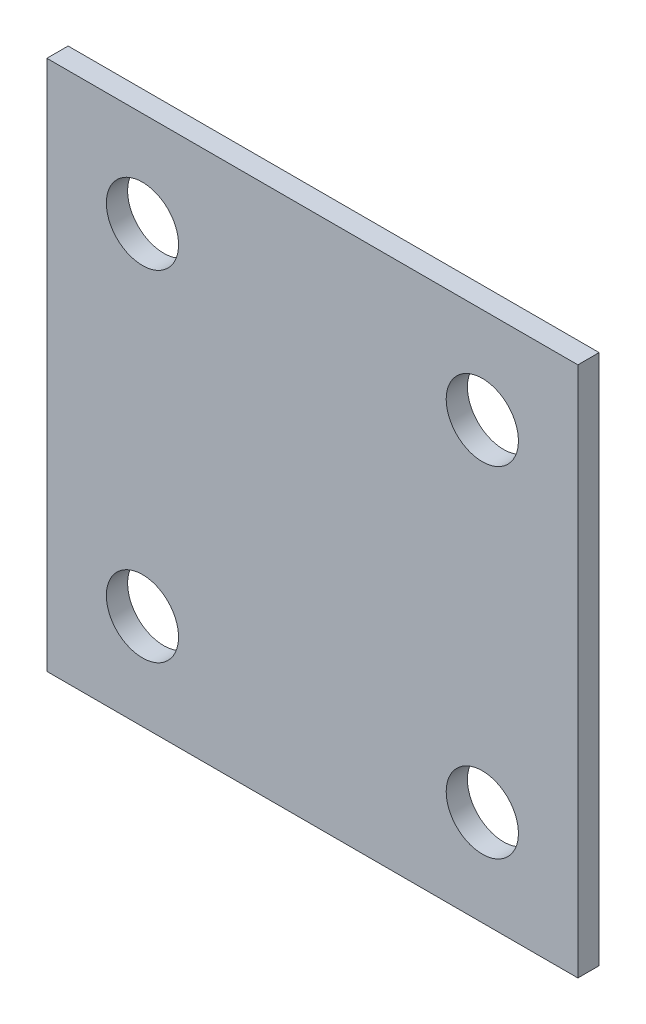
ISO-10303-21;
HEADER;
FILE_DESCRIPTION(('STEP AP214'),'2;1');
FILE_NAME('part.step','',(''),(''),'','','');
FILE_SCHEMA(('AUTOMOTIVE_DESIGN { 1 0 10303 214 1 1 1 1 }'));
ENDSEC;
DATA;
#1=APPLICATION_CONTEXT('core data for automotive mechanical design processes');
#2=APPLICATION_PROTOCOL_DEFINITION('international standard','automotive_design',2000,#1);
#3=PRODUCT_CONTEXT('',#1,'mechanical');
#4=PRODUCT('Part','Part','',(#3));
#5=PRODUCT_RELATED_PRODUCT_CATEGORY('part','',(#4));
#6=PRODUCT_DEFINITION_FORMATION('','',#4);
#7=PRODUCT_DEFINITION_CONTEXT('part definition',#1,'design');
#8=PRODUCT_DEFINITION('design','',#6,#7);
#9=PRODUCT_DEFINITION_SHAPE('','',#8);
#10=(LENGTH_UNIT() NAMED_UNIT(*) SI_UNIT(.MILLI.,.METRE.));
#11=(NAMED_UNIT(*) PLANE_ANGLE_UNIT() SI_UNIT($,.RADIAN.));
#12=(NAMED_UNIT(*) SI_UNIT($,.STERADIAN.) SOLID_ANGLE_UNIT());
#13=UNCERTAINTY_MEASURE_WITH_UNIT(LENGTH_MEASURE(1.E-05),#10,'distance_accuracy_value','');
#14=(GEOMETRIC_REPRESENTATION_CONTEXT(3) GLOBAL_UNCERTAINTY_ASSIGNED_CONTEXT((#13)) GLOBAL_UNIT_ASSIGNED_CONTEXT((#10,
#11,#12)) REPRESENTATION_CONTEXT('',''));
#15=CARTESIAN_POINT('',(0.,0.,0.));
#16=DIRECTION('',(0.,0.,1.));
#17=DIRECTION('',(1.,0.,0.));
#18=AXIS2_PLACEMENT_3D('',#15,#16,#17);
#19=CARTESIAN_POINT('',(-12.4999999999998,-12.5000000000002,1.));
#20=DIRECTION('',(1.,0.,0.));
#21=DIRECTION('',(0.,0.,-0.999999999999998));
#22=AXIS2_PLACEMENT_3D('',#19,#20,#21);
#23=PLANE('',#22);
#24=DIRECTION('',(0.,-1.,0.));
#25=VECTOR('',#24,1.);
#26=CARTESIAN_POINT('',(-12.4999999999998,-12.5000000000002,0.));
#27=LINE('',#26,#25);
#28=CARTESIAN_POINT('',(-12.5,12.4999999999998,0.));
#29=VERTEX_POINT('',#28);
#30=CARTESIAN_POINT('',(-12.4999999999998,-12.5000000000002,0.));
#31=VERTEX_POINT('',#30);
#32=EDGE_CURVE('E95',#29,#31,#27,.T.);
#33=ORIENTED_EDGE('',*,*,#32,.T.);
#34=DIRECTION('',(0.,0.,-0.999999999999998));
#35=VECTOR('',#34,1.);
#36=CARTESIAN_POINT('',(-12.4999999999998,-12.5000000000002,1.));
#37=LINE('',#36,#35);
#38=CARTESIAN_POINT('',(-12.4999999999998,-12.5000000000002,1.));
#39=VERTEX_POINT('',#38);
#40=EDGE_CURVE('E11',#39,#31,#37,.T.);
#41=ORIENTED_EDGE('',*,*,#40,.F.);
#42=DIRECTION('',(0.,-1.,0.));
#43=VECTOR('',#42,1.);
#44=CARTESIAN_POINT('',(-12.4999999999998,-12.5000000000002,1.));
#45=LINE('',#44,#43);
#46=CARTESIAN_POINT('',(-12.5,12.4999999999998,0.999999999999997));
#47=VERTEX_POINT('',#46);
#48=EDGE_CURVE('E83',#47,#39,#45,.T.);
#49=ORIENTED_EDGE('',*,*,#48,.F.);
#50=DIRECTION('',(0.,0.,-0.999999999999998));
#51=VECTOR('',#50,1.);
#52=CARTESIAN_POINT('',(-12.5,12.4999999999998,0.999999999999997));
#53=LINE('',#52,#51);
#54=EDGE_CURVE('E91',#47,#29,#53,.T.);
#55=ORIENTED_EDGE('',*,*,#54,.T.);
#56=EDGE_LOOP('',(#33,#41,#49,#55));
#57=FACE_BOUND('',#56,.T.);
#58=ADVANCED_FACE('F32',(#57),#23,.F.);
#59=CARTESIAN_POINT('',(12.5000000000002,-12.5,1.));
#60=DIRECTION('',(0.,1.,0.));
#61=DIRECTION('',(-1.,0.,0.));
#62=AXIS2_PLACEMENT_3D('',#59,#60,#61);
#63=PLANE('',#62);
#64=DIRECTION('',(1.,0.,0.));
#65=VECTOR('',#64,1.);
#66=CARTESIAN_POINT('',(12.5000000000002,-12.5,0.));
#67=LINE('',#66,#65);
#68=CARTESIAN_POINT('',(12.5000000000002,-12.5,0.));
#69=VERTEX_POINT('',#68);
#70=EDGE_CURVE('E87',#31,#69,#67,.T.);
#71=ORIENTED_EDGE('',*,*,#70,.T.);
#72=DIRECTION('',(0.,0.,-0.999999999999998));
#73=VECTOR('',#72,1.);
#74=CARTESIAN_POINT('',(12.5000000000002,-12.5,1.));
#75=LINE('',#74,#73);
#76=CARTESIAN_POINT('',(12.5000000000002,-12.5,1.));
#77=VERTEX_POINT('',#76);
#78=EDGE_CURVE('E40',#77,#69,#75,.T.);
#79=ORIENTED_EDGE('',*,*,#78,.F.);
#80=DIRECTION('',(1.,0.,0.));
#81=VECTOR('',#80,1.);
#82=CARTESIAN_POINT('',(12.5000000000002,-12.5,1.));
#83=LINE('',#82,#81);
#84=EDGE_CURVE('E78',#39,#77,#83,.T.);
#85=ORIENTED_EDGE('',*,*,#84,.F.);
#86=ORIENTED_EDGE('',*,*,#40,.T.);
#87=EDGE_LOOP('',(#71,#79,#85,#86));
#88=FACE_BOUND('',#87,.T.);
#89=ADVANCED_FACE('F86',(#88),#63,.F.);
#90=CARTESIAN_POINT('',(12.5000000000002,-12.5,1.));
#91=DIRECTION('',(-1.,0.,0.));
#92=DIRECTION('',(0.,0.,0.999999999999998));
#93=AXIS2_PLACEMENT_3D('',#90,#91,#92);
#94=PLANE('',#93);
#95=DIRECTION('',(0.,1.,0.));
#96=VECTOR('',#95,1.);
#97=CARTESIAN_POINT('',(12.5000000000002,-12.5,0.));
#98=LINE('',#97,#96);
#99=CARTESIAN_POINT('',(12.5000000000001,12.5,0.));
#100=VERTEX_POINT('',#99);
#101=EDGE_CURVE('E65',#69,#100,#98,.T.);
#102=ORIENTED_EDGE('',*,*,#101,.T.);
#103=DIRECTION('',(0.,0.,-0.999999999999998));
#104=VECTOR('',#103,1.);
#105=CARTESIAN_POINT('',(12.5000000000001,12.5,0.999999999999997));
#106=LINE('',#105,#104);
#107=CARTESIAN_POINT('',(12.5000000000001,12.5,0.999999999999997));
#108=VERTEX_POINT('',#107);
#109=EDGE_CURVE('E88',#108,#100,#106,.T.);
#110=ORIENTED_EDGE('',*,*,#109,.F.);
#111=DIRECTION('',(0.,1.,0.));
#112=VECTOR('',#111,1.);
#113=CARTESIAN_POINT('',(12.5000000000002,-12.5,1.));
#114=LINE('',#113,#112);
#115=EDGE_CURVE('E81',#77,#108,#114,.T.);
#116=ORIENTED_EDGE('',*,*,#115,.F.);
#117=ORIENTED_EDGE('',*,*,#78,.T.);
#118=EDGE_LOOP('',(#102,#110,#116,#117));
#119=FACE_BOUND('',#118,.T.);
#120=ADVANCED_FACE('F89',(#119),#94,.F.);
#121=CARTESIAN_POINT('',(12.5000000000001,12.5,0.999999999999997));
#122=DIRECTION('',(0.,-1.,0.));
#123=DIRECTION('',(1.,0.,0.));
#124=AXIS2_PLACEMENT_3D('',#121,#122,#123);
#125=PLANE('',#124);
#126=DIRECTION('',(-1.,0.,0.));
#127=VECTOR('',#126,1.);
#128=CARTESIAN_POINT('',(12.5000000000001,12.5,0.));
#129=LINE('',#128,#127);
#130=EDGE_CURVE('E71',#100,#29,#129,.T.);
#131=ORIENTED_EDGE('',*,*,#130,.T.);
#132=ORIENTED_EDGE('',*,*,#54,.F.);
#133=DIRECTION('',(-1.,0.,0.));
#134=VECTOR('',#133,1.);
#135=CARTESIAN_POINT('',(12.5000000000001,12.5,0.999999999999997));
#136=LINE('',#135,#134);
#137=EDGE_CURVE('E48',#108,#47,#136,.T.);
#138=ORIENTED_EDGE('',*,*,#137,.F.);
#139=ORIENTED_EDGE('',*,*,#109,.T.);
#140=EDGE_LOOP('',(#131,#132,#138,#139));
#141=FACE_BOUND('',#140,.T.);
#142=ADVANCED_FACE('F103',(#141),#125,.F.);
#143=CARTESIAN_POINT('',(0.,0.,0.999999999999997));
#144=DIRECTION('',(0.,0.,0.999999999999998));
#145=DIRECTION('',(1.,0.,0.));
#146=AXIS2_PLACEMENT_3D('',#143,#144,#145);
#147=PLANE('',#146);
#148=CARTESIAN_POINT('',(-7.99999999999977,-8.00000000000001,1.));
#149=DIRECTION('',(0.,0.,-0.999999999999998));
#150=DIRECTION('',(-1.,0.,0.));
#151=AXIS2_PLACEMENT_3D('',#148,#149,#150);
#152=CIRCLE('',#151,1.7);
#153=CARTESIAN_POINT('',(-9.7,-8.00000000000001,1.));
#154=VERTEX_POINT('',#153);
#155=EDGE_CURVE('E126',#154,#154,#152,.T.);
#156=ORIENTED_EDGE('',*,*,#155,.T.);
#157=EDGE_LOOP('',(#156));
#158=FACE_BOUND('',#157,.T.);
#159=CARTESIAN_POINT('',(-7.99999999999979,8.00000000000001,0.999999999999997));
#160=DIRECTION('',(0.,0.,-0.999999999999998));
#161=DIRECTION('',(-1.,0.,0.));
#162=AXIS2_PLACEMENT_3D('',#159,#160,#161);
#163=CIRCLE('',#162,1.7);
#164=CARTESIAN_POINT('',(-9.70000000000001,7.99999999999995,0.999999999999997));
#165=VERTEX_POINT('',#164);
#166=EDGE_CURVE('E120',#165,#165,#163,.T.);
#167=ORIENTED_EDGE('',*,*,#166,.T.);
#168=EDGE_LOOP('',(#167));
#169=FACE_BOUND('',#168,.T.);
#170=CARTESIAN_POINT('',(8.00000000000023,7.99999999999995,0.999999999999997));
#171=DIRECTION('',(0.,0.,-0.999999999999998));
#172=DIRECTION('',(-1.,0.,0.));
#173=AXIS2_PLACEMENT_3D('',#170,#171,#172);
#174=CIRCLE('',#173,1.7);
#175=CARTESIAN_POINT('',(6.30000000000022,7.99999999999979,0.999999999999997));
#176=VERTEX_POINT('',#175);
#177=EDGE_CURVE('E114',#176,#176,#174,.T.);
#178=ORIENTED_EDGE('',*,*,#177,.T.);
#179=EDGE_LOOP('',(#178));
#180=FACE_BOUND('',#179,.T.);
#181=CARTESIAN_POINT('',(8.00000000000024,-8.00000000000001,1.));
#182=DIRECTION('',(0.,0.,-0.999999999999998));
#183=DIRECTION('',(-1.,0.,0.));
#184=AXIS2_PLACEMENT_3D('',#181,#182,#183);
#185=CIRCLE('',#184,1.7);
#186=CARTESIAN_POINT('',(6.30000000000024,-8.00000000000017,1.));
#187=VERTEX_POINT('',#186);
#188=EDGE_CURVE('E98',#187,#187,#185,.T.);
#189=ORIENTED_EDGE('',*,*,#188,.T.);
#190=EDGE_LOOP('',(#189));
#191=FACE_BOUND('',#190,.T.);
#192=ORIENTED_EDGE('',*,*,#48,.T.);
#193=ORIENTED_EDGE('',*,*,#84,.T.);
#194=ORIENTED_EDGE('',*,*,#115,.T.);
#195=ORIENTED_EDGE('',*,*,#137,.T.);
#196=EDGE_LOOP('',(#192,#193,#194,#195));
#197=FACE_BOUND('',#196,.T.);
#198=ADVANCED_FACE('F79',(#158,#169,#180,#191,#197),#147,.T.);
#199=CARTESIAN_POINT('',(0.,0.,0.));
#200=DIRECTION('',(0.,0.,0.999999999999998));
#201=DIRECTION('',(1.,0.,0.));
#202=AXIS2_PLACEMENT_3D('',#199,#200,#201);
#203=PLANE('',#202);
#204=CARTESIAN_POINT('',(-7.99999999999999,-8.00000000000001,0.));
#205=DIRECTION('',(0.,0.,-0.999999999999998));
#206=DIRECTION('',(-1.,0.,0.));
#207=AXIS2_PLACEMENT_3D('',#204,#205,#206);
#208=CIRCLE('',#207,1.7);
#209=CARTESIAN_POINT('',(-9.7,-8.00000000000001,0.));
#210=VERTEX_POINT('',#209);
#211=EDGE_CURVE('E129',#210,#210,#208,.T.);
#212=ORIENTED_EDGE('',*,*,#211,.F.);
#213=EDGE_LOOP('',(#212));
#214=FACE_BOUND('',#213,.T.);
#215=CARTESIAN_POINT('',(-8.00000000000001,7.99999999999995,0.));
#216=DIRECTION('',(0.,0.,-0.999999999999998));
#217=DIRECTION('',(-1.,0.,0.));
#218=AXIS2_PLACEMENT_3D('',#215,#216,#217);
#219=CIRCLE('',#218,1.7);
#220=CARTESIAN_POINT('',(-9.70000000000001,7.99999999999995,0.));
#221=VERTEX_POINT('',#220);
#222=EDGE_CURVE('E123',#221,#221,#219,.T.);
#223=ORIENTED_EDGE('',*,*,#222,.F.);
#224=EDGE_LOOP('',(#223));
#225=FACE_BOUND('',#224,.T.);
#226=CARTESIAN_POINT('',(8.00000000000023,7.99999999999979,0.));
#227=DIRECTION('',(0.,0.,-0.999999999999998));
#228=DIRECTION('',(-1.,0.,0.));
#229=AXIS2_PLACEMENT_3D('',#226,#227,#228);
#230=CIRCLE('',#229,1.7);
#231=CARTESIAN_POINT('',(6.30000000000022,7.99999999999979,0.));
#232=VERTEX_POINT('',#231);
#233=EDGE_CURVE('E117',#232,#232,#230,.T.);
#234=ORIENTED_EDGE('',*,*,#233,.F.);
#235=EDGE_LOOP('',(#234));
#236=FACE_BOUND('',#235,.T.);
#237=CARTESIAN_POINT('',(8.00000000000024,-8.00000000000017,0.));
#238=DIRECTION('',(0.,0.,-0.999999999999998));
#239=DIRECTION('',(-1.,0.,0.));
#240=AXIS2_PLACEMENT_3D('',#237,#238,#239);
#241=CIRCLE('',#240,1.7);
#242=CARTESIAN_POINT('',(6.30000000000024,-8.00000000000017,0.));
#243=VERTEX_POINT('',#242);
#244=EDGE_CURVE('E111',#243,#243,#241,.T.);
#245=ORIENTED_EDGE('',*,*,#244,.F.);
#246=EDGE_LOOP('',(#245));
#247=FACE_BOUND('',#246,.T.);
#248=ORIENTED_EDGE('',*,*,#32,.F.);
#249=ORIENTED_EDGE('',*,*,#130,.F.);
#250=ORIENTED_EDGE('',*,*,#101,.F.);
#251=ORIENTED_EDGE('',*,*,#70,.F.);
#252=EDGE_LOOP('',(#248,#249,#250,#251));
#253=FACE_BOUND('',#252,.T.);
#254=ADVANCED_FACE('F106',(#214,#225,#236,#247,#253),#203,.F.);
#255=CARTESIAN_POINT('',(8.00000000000024,-8.00000000000017,0.));
#256=DIRECTION('',(0.,0.,-0.999999999999998));
#257=DIRECTION('',(-1.,0.,0.));
#258=AXIS2_PLACEMENT_3D('',#255,#256,#257);
#259=CYLINDRICAL_SURFACE('',#258,1.7);
#260=CARTESIAN_POINT('',(6.30000000000024,-8.00000000000017,1.));
#261=CARTESIAN_POINT('',(6.30000000000024,-8.00000000000017,0.989583333333333));
#262=CARTESIAN_POINT('',(6.30000000000024,-8.00000000000017,0.979166666666666));
#263=CARTESIAN_POINT('',(6.30000000000024,-8.00000000000017,0.958333333333333));
#264=CARTESIAN_POINT('',(6.30000000000024,-8.00000000000017,0.947916666666666));
#265=CARTESIAN_POINT('',(6.30000000000024,-8.00000000000017,0.927083333333333));
#266=CARTESIAN_POINT('',(6.30000000000024,-8.00000000000017,0.916666666666666));
#267=CARTESIAN_POINT('',(6.30000000000024,-8.00000000000017,0.895833333333333));
#268=CARTESIAN_POINT('',(6.30000000000024,-8.00000000000017,0.885416666666667));
#269=CARTESIAN_POINT('',(6.30000000000024,-8.00000000000017,0.864583333333333));
#270=CARTESIAN_POINT('',(6.30000000000024,-8.00000000000017,0.854166666666667));
#271=CARTESIAN_POINT('',(6.30000000000024,-8.00000000000017,0.833333333333333));
#272=CARTESIAN_POINT('',(6.30000000000024,-8.00000000000017,0.822916666666667));
#273=CARTESIAN_POINT('',(6.30000000000024,-8.00000000000017,0.802083333333333));
#274=CARTESIAN_POINT('',(6.30000000000024,-8.00000000000017,0.791666666666667));
#275=CARTESIAN_POINT('',(6.30000000000024,-8.00000000000017,0.770833333333333));
#276=CARTESIAN_POINT('',(6.30000000000024,-8.00000000000017,0.760416666666667));
#277=CARTESIAN_POINT('',(6.30000000000024,-8.00000000000017,0.739583333333333));
#278=CARTESIAN_POINT('',(6.30000000000024,-8.00000000000017,0.729166666666667));
#279=CARTESIAN_POINT('',(6.30000000000024,-8.00000000000017,0.708333333333334));
#280=CARTESIAN_POINT('',(6.30000000000024,-8.00000000000017,0.697916666666667));
#281=CARTESIAN_POINT('',(6.30000000000024,-8.00000000000017,0.677083333333334));
#282=CARTESIAN_POINT('',(6.30000000000024,-8.00000000000017,0.666666666666667));
#283=CARTESIAN_POINT('',(6.30000000000024,-8.00000000000017,0.645833333333334));
#284=CARTESIAN_POINT('',(6.30000000000024,-8.00000000000017,0.635416666666667));
#285=CARTESIAN_POINT('',(6.30000000000024,-8.00000000000017,0.614583333333334));
#286=CARTESIAN_POINT('',(6.30000000000024,-8.00000000000017,0.604166666666667));
#287=CARTESIAN_POINT('',(6.30000000000024,-8.00000000000017,0.583333333333334));
#288=CARTESIAN_POINT('',(6.30000000000024,-8.00000000000017,0.572916666666667));
#289=CARTESIAN_POINT('',(6.30000000000024,-8.00000000000017,0.552083333333334));
#290=CARTESIAN_POINT('',(6.30000000000024,-8.00000000000017,0.541666666666667));
#291=CARTESIAN_POINT('',(6.30000000000024,-8.00000000000017,0.520833333333334));
#292=CARTESIAN_POINT('',(6.30000000000024,-8.00000000000017,0.510416666666667));
#293=CARTESIAN_POINT('',(6.30000000000024,-8.00000000000017,0.489583333333334));
#294=CARTESIAN_POINT('',(6.30000000000024,-8.00000000000017,0.479166666666667));
#295=CARTESIAN_POINT('',(6.30000000000024,-8.00000000000017,0.458333333333334));
#296=CARTESIAN_POINT('',(6.30000000000024,-8.00000000000017,0.447916666666667));
#297=CARTESIAN_POINT('',(6.30000000000024,-8.00000000000017,0.427083333333334));
#298=CARTESIAN_POINT('',(6.30000000000024,-8.00000000000017,0.416666666666668));
#299=CARTESIAN_POINT('',(6.30000000000024,-8.00000000000017,0.395833333333334));
#300=CARTESIAN_POINT('',(6.30000000000024,-8.00000000000017,0.385416666666668));
#301=CARTESIAN_POINT('',(6.30000000000024,-8.00000000000017,0.364583333333334));
#302=CARTESIAN_POINT('',(6.30000000000024,-8.00000000000017,0.354166666666668));
#303=CARTESIAN_POINT('',(6.30000000000024,-8.00000000000017,0.333333333333334));
#304=CARTESIAN_POINT('',(6.30000000000024,-8.00000000000017,0.322916666666668));
#305=CARTESIAN_POINT('',(6.30000000000024,-8.00000000000017,0.302083333333334));
#306=CARTESIAN_POINT('',(6.30000000000024,-8.00000000000017,0.291666666666668));
#307=CARTESIAN_POINT('',(6.30000000000024,-8.00000000000017,0.270833333333335));
#308=CARTESIAN_POINT('',(6.30000000000024,-8.00000000000017,0.260416666666668));
#309=CARTESIAN_POINT('',(6.30000000000024,-8.00000000000017,0.239583333333335));
#310=CARTESIAN_POINT('',(6.30000000000024,-8.00000000000017,0.229166666666668));
#311=CARTESIAN_POINT('',(6.30000000000024,-8.00000000000017,0.208333333333335));
#312=CARTESIAN_POINT('',(6.30000000000024,-8.00000000000017,0.197916666666668));
#313=CARTESIAN_POINT('',(6.30000000000024,-8.00000000000017,0.177083333333335));
#314=CARTESIAN_POINT('',(6.30000000000024,-8.00000000000017,0.166666666666668));
#315=CARTESIAN_POINT('',(6.30000000000024,-8.00000000000017,0.145833333333335));
#316=CARTESIAN_POINT('',(6.30000000000024,-8.00000000000017,0.135416666666668));
#317=CARTESIAN_POINT('',(6.30000000000024,-8.00000000000017,0.114583333333335));
#318=CARTESIAN_POINT('',(6.30000000000024,-8.00000000000017,0.104166666666668));
#319=CARTESIAN_POINT('',(6.30000000000024,-8.00000000000017,0.0833333333333349));
#320=CARTESIAN_POINT('',(6.30000000000024,-8.00000000000017,0.0729166666666682));
#321=CARTESIAN_POINT('',(6.30000000000024,-8.00000000000017,0.052083333333335));
#322=CARTESIAN_POINT('',(6.30000000000024,-8.00000000000017,0.0416666666666683));
#323=CARTESIAN_POINT('',(6.30000000000024,-8.00000000000017,0.020833333333335));
#324=CARTESIAN_POINT('',(6.30000000000024,-8.00000000000017,0.0104166666666684));
#325=CARTESIAN_POINT('',(6.30000000000024,-8.00000000000017,0.));
#326=B_SPLINE_CURVE_WITH_KNOTS('',3,(#260,#261,#262,#263,#264,#265,#266,#267,#268,#269,#270,
#271,#272,#273,#274,#275,#276,#277,#278,#279,#280,#281,#282,#283,#284,#285,#286,#287,#288,#289,
#290,#291,#292,#293,#294,#295,#296,#297,#298,#299,#300,#301,#302,#303,#304,#305,#306,#307,#308,
#309,#310,#311,#312,#313,#314,#315,#316,#317,#318,#319,#320,#321,#322,#323,#324,#325),
.UNSPECIFIED.,.F.,.F.,(4,2,2,2,2,2,2,2,2,2,2,2,2,2,2,2,2,2,2,2,2,2,2,2,2,2,2,2,2,2,2,2,4),(0.,
0.03125,0.0624999999999998,0.0937499999999999,0.125,0.15625,0.1875,0.21875,0.249999999999999,
0.281249999999999,0.312499999999999,0.343749999999999,0.374999999999999,0.406249999999999,
0.437499999999999,0.468749999999999,0.499999999999999,0.531249999999999,0.562499999999999,
0.593749999999999,0.624999999999999,0.656249999999999,0.687499999999999,0.718749999999998,
0.749999999999998,0.781249999999999,0.812499999999998,0.843749999999998,0.874999999999998,
0.906249999999998,0.937499999999998,0.968749999999998,0.999999999999998),.UNSPECIFIED.);
#327=EDGE_CURVE('BSEAM137',#187,#243,#326,.T.);
#328=ORIENTED_EDGE('',*,*,#188,.F.);
#329=ORIENTED_EDGE('',*,*,#244,.T.);
#330=ORIENTED_EDGE('',*,*,#327,.T.);
#331=ORIENTED_EDGE('',*,*,#327,.F.);
#332=EDGE_LOOP('',(#328,#330,#329,#331));
#333=FACE_BOUND('',#332,.T.);
#334=ADVANCED_FACE('F137',(#333),#259,.F.);
#335=CARTESIAN_POINT('',(8.00000000000023,7.99999999999979,0.));
#336=DIRECTION('',(0.,0.,-0.999999999999998));
#337=DIRECTION('',(-1.,0.,0.));
#338=AXIS2_PLACEMENT_3D('',#335,#336,#337);
#339=CYLINDRICAL_SURFACE('',#338,1.7);
#340=CARTESIAN_POINT('',(6.30000000000022,7.99999999999979,0.999999999999997));
#341=CARTESIAN_POINT('',(6.30000000000022,7.99999999999979,0.98958333333333));
#342=CARTESIAN_POINT('',(6.30000000000022,7.99999999999979,0.979166666666664));
#343=CARTESIAN_POINT('',(6.30000000000022,7.99999999999979,0.95833333333333));
#344=CARTESIAN_POINT('',(6.30000000000022,7.99999999999979,0.947916666666664));
#345=CARTESIAN_POINT('',(6.30000000000022,7.99999999999979,0.92708333333333));
#346=CARTESIAN_POINT('',(6.30000000000022,7.99999999999979,0.916666666666664));
#347=CARTESIAN_POINT('',(6.30000000000022,7.99999999999979,0.89583333333333));
#348=CARTESIAN_POINT('',(6.30000000000022,7.99999999999979,0.885416666666664));
#349=CARTESIAN_POINT('',(6.30000000000022,7.99999999999979,0.86458333333333));
#350=CARTESIAN_POINT('',(6.30000000000022,7.99999999999979,0.854166666666664));
#351=CARTESIAN_POINT('',(6.30000000000022,7.99999999999979,0.83333333333333));
#352=CARTESIAN_POINT('',(6.30000000000022,7.99999999999979,0.822916666666664));
#353=CARTESIAN_POINT('',(6.30000000000022,7.99999999999979,0.802083333333331));
#354=CARTESIAN_POINT('',(6.30000000000022,7.99999999999979,0.791666666666664));
#355=CARTESIAN_POINT('',(6.30000000000022,7.99999999999979,0.770833333333331));
#356=CARTESIAN_POINT('',(6.30000000000022,7.99999999999979,0.760416666666664));
#357=CARTESIAN_POINT('',(6.30000000000022,7.99999999999979,0.739583333333331));
#358=CARTESIAN_POINT('',(6.30000000000022,7.99999999999979,0.729166666666664));
#359=CARTESIAN_POINT('',(6.30000000000022,7.99999999999979,0.708333333333331));
#360=CARTESIAN_POINT('',(6.30000000000022,7.99999999999979,0.697916666666664));
#361=CARTESIAN_POINT('',(6.30000000000022,7.99999999999979,0.677083333333331));
#362=CARTESIAN_POINT('',(6.30000000000022,7.99999999999979,0.666666666666664));
#363=CARTESIAN_POINT('',(6.30000000000022,7.99999999999979,0.645833333333331));
#364=CARTESIAN_POINT('',(6.30000000000022,7.99999999999979,0.635416666666664));
#365=CARTESIAN_POINT('',(6.30000000000022,7.99999999999979,0.614583333333331));
#366=CARTESIAN_POINT('',(6.30000000000022,7.99999999999979,0.604166666666664));
#367=CARTESIAN_POINT('',(6.30000000000022,7.99999999999979,0.583333333333331));
#368=CARTESIAN_POINT('',(6.30000000000022,7.99999999999979,0.572916666666664));
#369=CARTESIAN_POINT('',(6.30000000000022,7.99999999999979,0.552083333333331));
#370=CARTESIAN_POINT('',(6.30000000000022,7.99999999999979,0.541666666666664));
#371=CARTESIAN_POINT('',(6.30000000000022,7.99999999999979,0.520833333333331));
#372=CARTESIAN_POINT('',(6.30000000000022,7.99999999999979,0.510416666666664));
#373=CARTESIAN_POINT('',(6.30000000000022,7.99999999999979,0.489583333333331));
#374=CARTESIAN_POINT('',(6.30000000000022,7.99999999999979,0.479166666666664));
#375=CARTESIAN_POINT('',(6.30000000000022,7.99999999999979,0.458333333333331));
#376=CARTESIAN_POINT('',(6.30000000000022,7.99999999999979,0.447916666666664));
#377=CARTESIAN_POINT('',(6.30000000000022,7.99999999999979,0.427083333333331));
#378=CARTESIAN_POINT('',(6.30000000000022,7.99999999999979,0.416666666666664));
#379=CARTESIAN_POINT('',(6.30000000000022,7.99999999999979,0.395833333333331));
#380=CARTESIAN_POINT('',(6.30000000000022,7.99999999999979,0.385416666666664));
#381=CARTESIAN_POINT('',(6.30000000000022,7.99999999999979,0.364583333333331));
#382=CARTESIAN_POINT('',(6.30000000000022,7.99999999999979,0.354166666666664));
#383=CARTESIAN_POINT('',(6.30000000000022,7.99999999999979,0.333333333333331));
#384=CARTESIAN_POINT('',(6.30000000000022,7.99999999999979,0.322916666666665));
#385=CARTESIAN_POINT('',(6.30000000000022,7.99999999999979,0.302083333333331));
#386=CARTESIAN_POINT('',(6.30000000000022,7.99999999999979,0.291666666666665));
#387=CARTESIAN_POINT('',(6.30000000000022,7.99999999999979,0.270833333333331));
#388=CARTESIAN_POINT('',(6.30000000000022,7.99999999999979,0.260416666666665));
#389=CARTESIAN_POINT('',(6.30000000000022,7.99999999999979,0.239583333333331));
#390=CARTESIAN_POINT('',(6.30000000000022,7.99999999999979,0.229166666666665));
#391=CARTESIAN_POINT('',(6.30000000000022,7.99999999999979,0.208333333333331));
#392=CARTESIAN_POINT('',(6.30000000000022,7.99999999999979,0.197916666666665));
#393=CARTESIAN_POINT('',(6.30000000000022,7.99999999999979,0.177083333333331));
#394=CARTESIAN_POINT('',(6.30000000000022,7.99999999999979,0.166666666666665));
#395=CARTESIAN_POINT('',(6.30000000000022,7.99999999999979,0.145833333333331));
#396=CARTESIAN_POINT('',(6.30000000000022,7.99999999999979,0.135416666666665));
#397=CARTESIAN_POINT('',(6.30000000000022,7.99999999999979,0.114583333333331));
#398=CARTESIAN_POINT('',(6.30000000000022,7.99999999999979,0.104166666666665));
#399=CARTESIAN_POINT('',(6.30000000000022,7.99999999999979,0.0833333333333315));
#400=CARTESIAN_POINT('',(6.30000000000022,7.99999999999979,0.0729166666666649));
#401=CARTESIAN_POINT('',(6.30000000000022,7.99999999999979,0.0520833333333316));
#402=CARTESIAN_POINT('',(6.30000000000022,7.99999999999979,0.0416666666666649));
#403=CARTESIAN_POINT('',(6.30000000000022,7.99999999999979,0.0208333333333316));
#404=CARTESIAN_POINT('',(6.30000000000022,7.99999999999979,0.0104166666666649));
#405=CARTESIAN_POINT('',(6.30000000000022,7.99999999999979,0.));
#406=B_SPLINE_CURVE_WITH_KNOTS('',3,(#340,#341,#342,#343,#344,#345,#346,#347,#348,#349,#350,
#351,#352,#353,#354,#355,#356,#357,#358,#359,#360,#361,#362,#363,#364,#365,#366,#367,#368,#369,
#370,#371,#372,#373,#374,#375,#376,#377,#378,#379,#380,#381,#382,#383,#384,#385,#386,#387,#388,
#389,#390,#391,#392,#393,#394,#395,#396,#397,#398,#399,#400,#401,#402,#403,#404,#405),
.UNSPECIFIED.,.F.,.F.,(4,2,2,2,2,2,2,2,2,2,2,2,2,2,2,2,2,2,2,2,2,2,2,2,2,2,2,2,2,2,2,2,4),(0.,
0.03125,0.0624999999999999,0.09375,0.125,0.15625,0.1875,0.21875,0.25,0.28125,0.3125,0.34375,
0.374999999999999,0.40625,0.437499999999999,0.468749999999999,0.499999999999999,
0.531249999999999,0.562499999999999,0.593749999999999,0.624999999999999,0.656249999999999,
0.687499999999999,0.718749999999999,0.749999999999999,0.781249999999999,0.812499999999999,
0.843749999999999,0.874999999999999,0.906249999999999,0.937499999999999,0.968749999999999,
0.999999999999999),.UNSPECIFIED.);
#407=EDGE_CURVE('BSEAM146',#176,#232,#406,.T.);
#408=ORIENTED_EDGE('',*,*,#177,.F.);
#409=ORIENTED_EDGE('',*,*,#233,.T.);
#410=ORIENTED_EDGE('',*,*,#407,.T.);
#411=ORIENTED_EDGE('',*,*,#407,.F.);
#412=EDGE_LOOP('',(#408,#410,#409,#411));
#413=FACE_BOUND('',#412,.T.);
#414=ADVANCED_FACE('F146',(#413),#339,.F.);
#415=CARTESIAN_POINT('',(-8.00000000000001,7.99999999999995,0.));
#416=DIRECTION('',(0.,0.,-0.999999999999998));
#417=DIRECTION('',(-1.,0.,0.));
#418=AXIS2_PLACEMENT_3D('',#415,#416,#417);
#419=CYLINDRICAL_SURFACE('',#418,1.7);
#420=CARTESIAN_POINT('',(-9.70000000000001,7.99999999999995,0.999999999999997));
#421=CARTESIAN_POINT('',(-9.70000000000001,7.99999999999995,0.98958333333333));
#422=CARTESIAN_POINT('',(-9.70000000000001,7.99999999999995,0.979166666666664));
#423=CARTESIAN_POINT('',(-9.70000000000001,7.99999999999995,0.95833333333333));
#424=CARTESIAN_POINT('',(-9.70000000000001,7.99999999999995,0.947916666666664));
#425=CARTESIAN_POINT('',(-9.70000000000001,7.99999999999995,0.927083333333331));
#426=CARTESIAN_POINT('',(-9.70000000000001,7.99999999999995,0.916666666666664));
#427=CARTESIAN_POINT('',(-9.70000000000001,7.99999999999995,0.895833333333331));
#428=CARTESIAN_POINT('',(-9.70000000000001,7.99999999999995,0.885416666666664));
#429=CARTESIAN_POINT('',(-9.70000000000001,7.99999999999995,0.864583333333331));
#430=CARTESIAN_POINT('',(-9.70000000000001,7.99999999999995,0.854166666666664));
#431=CARTESIAN_POINT('',(-9.70000000000001,7.99999999999995,0.833333333333331));
#432=CARTESIAN_POINT('',(-9.70000000000001,7.99999999999995,0.822916666666664));
#433=CARTESIAN_POINT('',(-9.70000000000001,7.99999999999995,0.802083333333331));
#434=CARTESIAN_POINT('',(-9.70000000000001,7.99999999999995,0.791666666666664));
#435=CARTESIAN_POINT('',(-9.70000000000001,7.99999999999995,0.770833333333331));
#436=CARTESIAN_POINT('',(-9.70000000000001,7.99999999999995,0.760416666666664));
#437=CARTESIAN_POINT('',(-9.70000000000001,7.99999999999995,0.739583333333331));
#438=CARTESIAN_POINT('',(-9.70000000000001,7.99999999999995,0.729166666666664));
#439=CARTESIAN_POINT('',(-9.70000000000001,7.99999999999995,0.708333333333331));
#440=CARTESIAN_POINT('',(-9.70000000000001,7.99999999999995,0.697916666666665));
#441=CARTESIAN_POINT('',(-9.70000000000001,7.99999999999995,0.677083333333331));
#442=CARTESIAN_POINT('',(-9.70000000000001,7.99999999999995,0.666666666666665));
#443=CARTESIAN_POINT('',(-9.70000000000001,7.99999999999995,0.645833333333331));
#444=CARTESIAN_POINT('',(-9.70000000000001,7.99999999999995,0.635416666666665));
#445=CARTESIAN_POINT('',(-9.70000000000001,7.99999999999995,0.614583333333331));
#446=CARTESIAN_POINT('',(-9.70000000000001,7.99999999999995,0.604166666666665));
#447=CARTESIAN_POINT('',(-9.70000000000001,7.99999999999995,0.583333333333331));
#448=CARTESIAN_POINT('',(-9.70000000000001,7.99999999999995,0.572916666666665));
#449=CARTESIAN_POINT('',(-9.70000000000001,7.99999999999995,0.552083333333332));
#450=CARTESIAN_POINT('',(-9.70000000000001,7.99999999999995,0.541666666666665));
#451=CARTESIAN_POINT('',(-9.70000000000001,7.99999999999995,0.520833333333332));
#452=CARTESIAN_POINT('',(-9.70000000000001,7.99999999999995,0.510416666666665));
#453=CARTESIAN_POINT('',(-9.70000000000001,7.99999999999995,0.489583333333332));
#454=CARTESIAN_POINT('',(-9.70000000000001,7.99999999999995,0.479166666666665));
#455=CARTESIAN_POINT('',(-9.70000000000001,7.99999999999995,0.458333333333332));
#456=CARTESIAN_POINT('',(-9.70000000000001,7.99999999999995,0.447916666666665));
#457=CARTESIAN_POINT('',(-9.70000000000001,7.99999999999995,0.427083333333332));
#458=CARTESIAN_POINT('',(-9.70000000000001,7.99999999999995,0.416666666666665));
#459=CARTESIAN_POINT('',(-9.70000000000001,7.99999999999995,0.395833333333332));
#460=CARTESIAN_POINT('',(-9.70000000000001,7.99999999999995,0.385416666666665));
#461=CARTESIAN_POINT('',(-9.70000000000001,7.99999999999995,0.364583333333332));
#462=CARTESIAN_POINT('',(-9.70000000000001,7.99999999999995,0.354166666666666));
#463=CARTESIAN_POINT('',(-9.70000000000001,7.99999999999995,0.333333333333332));
#464=CARTESIAN_POINT('',(-9.70000000000001,7.99999999999995,0.322916666666666));
#465=CARTESIAN_POINT('',(-9.70000000000001,7.99999999999995,0.302083333333332));
#466=CARTESIAN_POINT('',(-9.70000000000001,7.99999999999995,0.291666666666666));
#467=CARTESIAN_POINT('',(-9.70000000000001,7.99999999999995,0.270833333333332));
#468=CARTESIAN_POINT('',(-9.70000000000001,7.99999999999995,0.260416666666666));
#469=CARTESIAN_POINT('',(-9.70000000000001,7.99999999999995,0.239583333333333));
#470=CARTESIAN_POINT('',(-9.70000000000001,7.99999999999995,0.229166666666666));
#471=CARTESIAN_POINT('',(-9.70000000000001,7.99999999999995,0.208333333333333));
#472=CARTESIAN_POINT('',(-9.70000000000001,7.99999999999995,0.197916666666666));
#473=CARTESIAN_POINT('',(-9.70000000000001,7.99999999999995,0.177083333333333));
#474=CARTESIAN_POINT('',(-9.70000000000001,7.99999999999995,0.166666666666666));
#475=CARTESIAN_POINT('',(-9.70000000000001,7.99999999999995,0.145833333333333));
#476=CARTESIAN_POINT('',(-9.70000000000001,7.99999999999995,0.135416666666666));
#477=CARTESIAN_POINT('',(-9.70000000000001,7.99999999999995,0.114583333333333));
#478=CARTESIAN_POINT('',(-9.70000000000001,7.99999999999995,0.104166666666666));
#479=CARTESIAN_POINT('',(-9.70000000000001,7.99999999999995,0.0833333333333331));
#480=CARTESIAN_POINT('',(-9.70000000000001,7.99999999999995,0.0729166666666664));
#481=CARTESIAN_POINT('',(-9.70000000000001,7.99999999999995,0.0520833333333332));
#482=CARTESIAN_POINT('',(-9.70000000000001,7.99999999999995,0.0416666666666665));
#483=CARTESIAN_POINT('',(-9.70000000000001,7.99999999999995,0.0208333333333332));
#484=CARTESIAN_POINT('',(-9.70000000000001,7.99999999999995,0.0104166666666666));
#485=CARTESIAN_POINT('',(-9.70000000000001,7.99999999999995,0.));
#486=B_SPLINE_CURVE_WITH_KNOTS('',3,(#420,#421,#422,#423,#424,#425,#426,#427,#428,#429,#430,
#431,#432,#433,#434,#435,#436,#437,#438,#439,#440,#441,#442,#443,#444,#445,#446,#447,#448,#449,
#450,#451,#452,#453,#454,#455,#456,#457,#458,#459,#460,#461,#462,#463,#464,#465,#466,#467,#468,
#469,#470,#471,#472,#473,#474,#475,#476,#477,#478,#479,#480,#481,#482,#483,#484,#485),
.UNSPECIFIED.,.F.,.F.,(4,2,2,2,2,2,2,2,2,2,2,2,2,2,2,2,2,2,2,2,2,2,2,2,2,2,2,2,2,2,2,2,4),(0.,
0.0312499999999999,0.0624999999999998,0.0937499999999998,0.125,0.15625,0.187499999999999,
0.218749999999999,0.249999999999999,0.281249999999999,0.312499999999999,0.343749999999999,
0.374999999999999,0.406249999999999,0.437499999999999,0.468749999999999,0.499999999999999,
0.531249999999998,0.562499999999998,0.593749999999998,0.624999999999998,0.656249999999998,
0.687499999999998,0.718749999999998,0.749999999999998,0.781249999999997,0.812499999999997,
0.843749999999997,0.874999999999997,0.906249999999997,0.937499999999997,0.968749999999997,
0.999999999999997),.UNSPECIFIED.);
#487=EDGE_CURVE('BSEAM152',#165,#221,#486,.T.);
#488=ORIENTED_EDGE('',*,*,#166,.F.);
#489=ORIENTED_EDGE('',*,*,#222,.T.);
#490=ORIENTED_EDGE('',*,*,#487,.T.);
#491=ORIENTED_EDGE('',*,*,#487,.F.);
#492=EDGE_LOOP('',(#488,#490,#489,#491));
#493=FACE_BOUND('',#492,.T.);
#494=ADVANCED_FACE('F152',(#493),#419,.F.);
#495=CARTESIAN_POINT('',(-7.99999999999999,-8.00000000000001,0.));
#496=DIRECTION('',(0.,0.,-0.999999999999998));
#497=DIRECTION('',(-1.,0.,0.));
#498=AXIS2_PLACEMENT_3D('',#495,#496,#497);
#499=CYLINDRICAL_SURFACE('',#498,1.7);
#500=CARTESIAN_POINT('',(-9.7,-8.00000000000001,1.));
#501=CARTESIAN_POINT('',(-9.7,-8.00000000000001,0.989583333333333));
#502=CARTESIAN_POINT('',(-9.7,-8.00000000000001,0.979166666666666));
#503=CARTESIAN_POINT('',(-9.7,-8.00000000000001,0.958333333333333));
#504=CARTESIAN_POINT('',(-9.7,-8.00000000000001,0.947916666666666));
#505=CARTESIAN_POINT('',(-9.7,-8.00000000000001,0.927083333333333));
#506=CARTESIAN_POINT('',(-9.7,-8.00000000000001,0.916666666666667));
#507=CARTESIAN_POINT('',(-9.7,-8.00000000000001,0.895833333333333));
#508=CARTESIAN_POINT('',(-9.7,-8.00000000000001,0.885416666666667));
#509=CARTESIAN_POINT('',(-9.7,-8.00000000000001,0.864583333333333));
#510=CARTESIAN_POINT('',(-9.7,-8.00000000000001,0.854166666666667));
#511=CARTESIAN_POINT('',(-9.7,-8.00000000000001,0.833333333333333));
#512=CARTESIAN_POINT('',(-9.7,-8.00000000000001,0.822916666666667));
#513=CARTESIAN_POINT('',(-9.7,-8.00000000000001,0.802083333333334));
#514=CARTESIAN_POINT('',(-9.7,-8.00000000000001,0.791666666666667));
#515=CARTESIAN_POINT('',(-9.7,-8.00000000000001,0.770833333333334));
#516=CARTESIAN_POINT('',(-9.7,-8.00000000000001,0.760416666666667));
#517=CARTESIAN_POINT('',(-9.7,-8.00000000000001,0.739583333333334));
#518=CARTESIAN_POINT('',(-9.7,-8.00000000000001,0.729166666666667));
#519=CARTESIAN_POINT('',(-9.7,-8.00000000000001,0.708333333333334));
#520=CARTESIAN_POINT('',(-9.7,-8.00000000000001,0.697916666666667));
#521=CARTESIAN_POINT('',(-9.7,-8.00000000000001,0.677083333333334));
#522=CARTESIAN_POINT('',(-9.7,-8.00000000000001,0.666666666666668));
#523=CARTESIAN_POINT('',(-9.7,-8.00000000000001,0.645833333333334));
#524=CARTESIAN_POINT('',(-9.7,-8.00000000000001,0.635416666666668));
#525=CARTESIAN_POINT('',(-9.7,-8.00000000000001,0.614583333333334));
#526=CARTESIAN_POINT('',(-9.7,-8.00000000000001,0.604166666666668));
#527=CARTESIAN_POINT('',(-9.7,-8.00000000000001,0.583333333333335));
#528=CARTESIAN_POINT('',(-9.7,-8.00000000000001,0.572916666666668));
#529=CARTESIAN_POINT('',(-9.7,-8.00000000000001,0.552083333333335));
#530=CARTESIAN_POINT('',(-9.7,-8.00000000000001,0.541666666666668));
#531=CARTESIAN_POINT('',(-9.7,-8.00000000000001,0.520833333333335));
#532=CARTESIAN_POINT('',(-9.7,-8.00000000000001,0.510416666666668));
#533=CARTESIAN_POINT('',(-9.7,-8.00000000000001,0.489583333333335));
#534=CARTESIAN_POINT('',(-9.7,-8.00000000000001,0.479166666666668));
#535=CARTESIAN_POINT('',(-9.7,-8.00000000000001,0.458333333333335));
#536=CARTESIAN_POINT('',(-9.7,-8.00000000000001,0.447916666666668));
#537=CARTESIAN_POINT('',(-9.7,-8.00000000000001,0.427083333333335));
#538=CARTESIAN_POINT('',(-9.7,-8.00000000000001,0.416666666666669));
#539=CARTESIAN_POINT('',(-9.7,-8.00000000000001,0.395833333333335));
#540=CARTESIAN_POINT('',(-9.7,-8.00000000000001,0.385416666666669));
#541=CARTESIAN_POINT('',(-9.7,-8.00000000000001,0.364583333333335));
#542=CARTESIAN_POINT('',(-9.7,-8.00000000000001,0.354166666666669));
#543=CARTESIAN_POINT('',(-9.7,-8.00000000000001,0.333333333333335));
#544=CARTESIAN_POINT('',(-9.7,-8.00000000000001,0.322916666666669));
#545=CARTESIAN_POINT('',(-9.7,-8.00000000000001,0.302083333333336));
#546=CARTESIAN_POINT('',(-9.7,-8.00000000000001,0.291666666666669));
#547=CARTESIAN_POINT('',(-9.7,-8.00000000000001,0.270833333333336));
#548=CARTESIAN_POINT('',(-9.7,-8.00000000000001,0.260416666666669));
#549=CARTESIAN_POINT('',(-9.7,-8.00000000000001,0.239583333333336));
#550=CARTESIAN_POINT('',(-9.7,-8.00000000000001,0.229166666666669));
#551=CARTESIAN_POINT('',(-9.7,-8.00000000000001,0.208333333333336));
#552=CARTESIAN_POINT('',(-9.7,-8.00000000000001,0.197916666666669));
#553=CARTESIAN_POINT('',(-9.7,-8.00000000000001,0.177083333333336));
#554=CARTESIAN_POINT('',(-9.7,-8.00000000000001,0.16666666666667));
#555=CARTESIAN_POINT('',(-9.7,-8.00000000000001,0.145833333333336));
#556=CARTESIAN_POINT('',(-9.7,-8.00000000000001,0.13541666666667));
#557=CARTESIAN_POINT('',(-9.7,-8.00000000000001,0.114583333333336));
#558=CARTESIAN_POINT('',(-9.7,-8.00000000000001,0.10416666666667));
#559=CARTESIAN_POINT('',(-9.7,-8.00000000000001,0.0833333333333365));
#560=CARTESIAN_POINT('',(-9.7,-8.00000000000001,0.0729166666666698));
#561=CARTESIAN_POINT('',(-9.7,-8.00000000000001,0.0520833333333366));
#562=CARTESIAN_POINT('',(-9.7,-8.00000000000001,0.04166666666667));
#563=CARTESIAN_POINT('',(-9.7,-8.00000000000001,0.0208333333333367));
#564=CARTESIAN_POINT('',(-9.7,-8.00000000000001,0.0104166666666701));
#565=CARTESIAN_POINT('',(-9.7,-8.00000000000001,0.));
#566=B_SPLINE_CURVE_WITH_KNOTS('',3,(#500,#501,#502,#503,#504,#505,#506,#507,#508,#509,#510,
#511,#512,#513,#514,#515,#516,#517,#518,#519,#520,#521,#522,#523,#524,#525,#526,#527,#528,#529,
#530,#531,#532,#533,#534,#535,#536,#537,#538,#539,#540,#541,#542,#543,#544,#545,#546,#547,#548,
#549,#550,#551,#552,#553,#554,#555,#556,#557,#558,#559,#560,#561,#562,#563,#564,#565),
.UNSPECIFIED.,.F.,.F.,(4,2,2,2,2,2,2,2,2,2,2,2,2,2,2,2,2,2,2,2,2,2,2,2,2,2,2,2,2,2,2,2,4),(0.,
0.0312499999999999,0.0624999999999997,0.0937499999999997,0.124999999999999,0.15625,
0.187499999999999,0.218749999999999,0.249999999999999,0.281249999999999,0.312499999999999,
0.343749999999999,0.374999999999999,0.406249999999998,0.437499999999998,0.468749999999998,
0.499999999999998,0.531249999999998,0.562499999999998,0.593749999999997,0.624999999999997,
0.656249999999997,0.687499999999997,0.718749999999997,0.749999999999997,0.781249999999997,
0.812499999999996,0.843749999999996,0.874999999999996,0.906249999999996,0.937499999999996,
0.968749999999996,0.999999999999995),.UNSPECIFIED.);
#567=EDGE_CURVE('BSEAM133',#154,#210,#566,.T.);
#568=ORIENTED_EDGE('',*,*,#155,.F.);
#569=ORIENTED_EDGE('',*,*,#211,.T.);
#570=ORIENTED_EDGE('',*,*,#567,.T.);
#571=ORIENTED_EDGE('',*,*,#567,.F.);
#572=EDGE_LOOP('',(#568,#570,#569,#571));
#573=FACE_BOUND('',#572,.T.);
#574=ADVANCED_FACE('F133',(#573),#499,.F.);
#575=CLOSED_SHELL('',(#58,#89,#120,#142,#198,#254,#334,#414,#494,#574));
#576=MANIFOLD_SOLID_BREP('B2',#575);
#577=ADVANCED_BREP_SHAPE_REPRESENTATION('',(#18,#576),#14);
#578=SHAPE_DEFINITION_REPRESENTATION(#9,#577);
ENDSEC;
END-ISO-10303-21;
